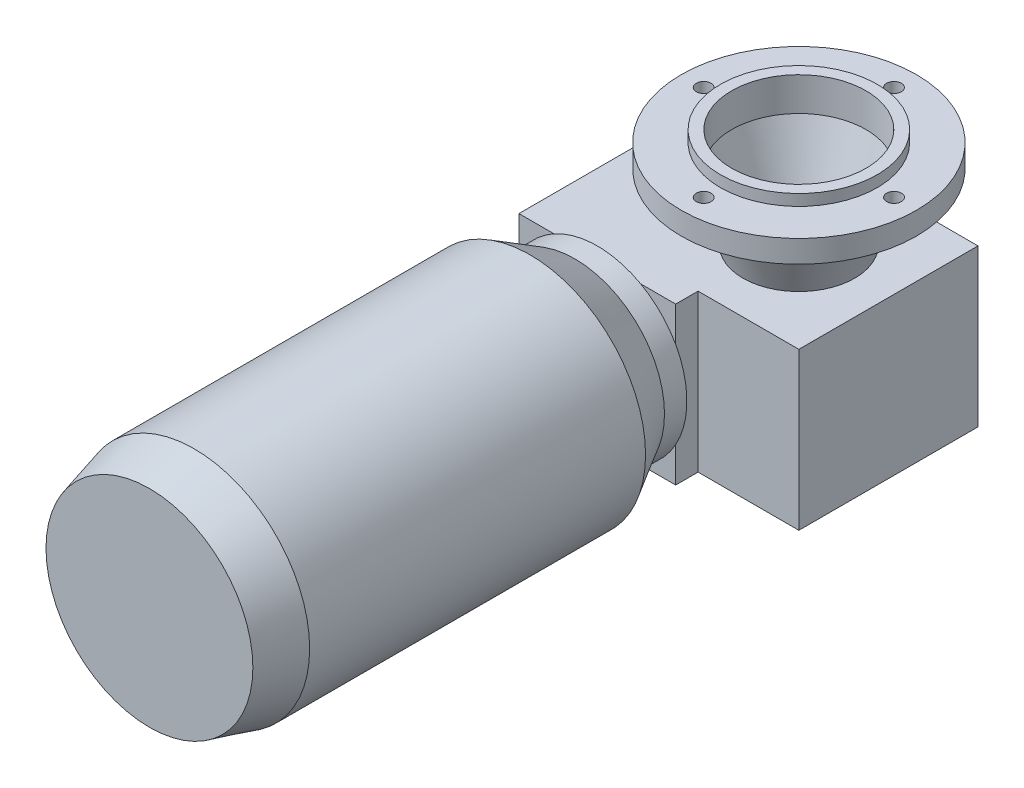
ISO-10303-21;
HEADER;
FILE_DESCRIPTION(('STEP AP214'),'2;1');
FILE_NAME('part.step','',(''),(''),'','','');
FILE_SCHEMA(('AUTOMOTIVE_DESIGN { 1 0 10303 214 1 1 1 1 }'));
ENDSEC;
DATA;
#1=APPLICATION_CONTEXT('core data for automotive mechanical design processes');
#2=APPLICATION_PROTOCOL_DEFINITION('international standard','automotive_design',2000,#1);
#3=PRODUCT_CONTEXT('',#1,'mechanical');
#4=PRODUCT('Part','Part','',(#3));
#5=PRODUCT_RELATED_PRODUCT_CATEGORY('part','',(#4));
#6=PRODUCT_DEFINITION_FORMATION('','',#4);
#7=PRODUCT_DEFINITION_CONTEXT('part definition',#1,'design');
#8=PRODUCT_DEFINITION('design','',#6,#7);
#9=PRODUCT_DEFINITION_SHAPE('','',#8);
#10=(LENGTH_UNIT() NAMED_UNIT(*) SI_UNIT(.MILLI.,.METRE.));
#11=(NAMED_UNIT(*) PLANE_ANGLE_UNIT() SI_UNIT($,.RADIAN.));
#12=(NAMED_UNIT(*) SI_UNIT($,.STERADIAN.) SOLID_ANGLE_UNIT());
#13=UNCERTAINTY_MEASURE_WITH_UNIT(LENGTH_MEASURE(1.E-05),#10,'distance_accuracy_value','');
#14=(GEOMETRIC_REPRESENTATION_CONTEXT(3) GLOBAL_UNCERTAINTY_ASSIGNED_CONTEXT((#13)) GLOBAL_UNIT_ASSIGNED_CONTEXT((#10,
#11,#12)) REPRESENTATION_CONTEXT('',''));
#15=CARTESIAN_POINT('',(0.,0.,0.));
#16=DIRECTION('',(0.,0.,1.));
#17=DIRECTION('',(1.,0.,0.));
#18=AXIS2_PLACEMENT_3D('',#15,#16,#17);
#19=CARTESIAN_POINT('',(-5.,-115.,-40.));
#20=DIRECTION('',(0.,1.,0.));
#21=DIRECTION('',(0.,0.,1.));
#22=AXIS2_PLACEMENT_3D('',#19,#20,#21);
#23=PLANE('',#22);
#24=DIRECTION('',(1.,0.,0.));
#25=VECTOR('',#24,1.);
#26=CARTESIAN_POINT('',(-5.,-115.,-40.));
#27=LINE('',#26,#25);
#28=CARTESIAN_POINT('',(-5.,-115.,-40.));
#29=VERTEX_POINT('',#28);
#30=CARTESIAN_POINT('',(40.,-115.,-40.));
#31=VERTEX_POINT('',#30);
#32=EDGE_CURVE('E198',#29,#31,#27,.T.);
#33=ORIENTED_EDGE('',*,*,#32,.T.);
#34=DIRECTION('',(0.,0.,1.));
#35=VECTOR('',#34,1.);
#36=CARTESIAN_POINT('',(40.,-115.,-40.));
#37=LINE('',#36,#35);
#38=CARTESIAN_POINT('',(40.,-115.,40.));
#39=VERTEX_POINT('',#38);
#40=EDGE_CURVE('E201',#31,#39,#37,.T.);
#41=ORIENTED_EDGE('',*,*,#40,.T.);
#42=DIRECTION('',(-1.,0.,0.));
#43=VECTOR('',#42,1.);
#44=CARTESIAN_POINT('',(40.,-115.,40.));
#45=LINE('',#44,#43);
#46=CARTESIAN_POINT('',(-5.,-115.,40.));
#47=VERTEX_POINT('',#46);
#48=EDGE_CURVE('E203',#39,#47,#45,.T.);
#49=ORIENTED_EDGE('',*,*,#48,.T.);
#50=DIRECTION('',(0.,0.,1.));
#51=VECTOR('',#50,1.);
#52=CARTESIAN_POINT('',(-5.,-115.,40.));
#53=LINE('',#52,#51);
#54=CARTESIAN_POINT('',(-5.,-115.,50.));
#55=VERTEX_POINT('',#54);
#56=EDGE_CURVE('E205',#47,#55,#53,.T.);
#57=ORIENTED_EDGE('',*,*,#56,.T.);
#58=DIRECTION('',(-1.,0.,0.));
#59=VECTOR('',#58,1.);
#60=CARTESIAN_POINT('',(-5.,-115.,50.));
#61=LINE('',#60,#59);
#62=CARTESIAN_POINT('',(-20.6350832689629,-115.,50.));
#63=VERTEX_POINT('',#62);
#64=EDGE_CURVE('E129',#55,#63,#61,.T.);
#65=ORIENTED_EDGE('',*,*,#64,.T.);
#66=CARTESIAN_POINT('',(-59.3649167310371,-115.,50.));
#67=VERTEX_POINT('',#66);
#68=EDGE_CURVE('E209',#63,#67,#61,.T.);
#69=ORIENTED_EDGE('',*,*,#68,.T.);
#70=CARTESIAN_POINT('',(-75.,-115.,50.));
#71=VERTEX_POINT('',#70);
#72=EDGE_CURVE('E56',#67,#71,#61,.T.);
#73=ORIENTED_EDGE('',*,*,#72,.T.);
#74=DIRECTION('',(0.,0.,-1.));
#75=VECTOR('',#74,1.);
#76=CARTESIAN_POINT('',(-75.,-115.,-60.));
#77=LINE('',#76,#75);
#78=CARTESIAN_POINT('',(-75.,-115.,-60.));
#79=VERTEX_POINT('',#78);
#80=EDGE_CURVE('E208',#71,#79,#77,.T.);
#81=ORIENTED_EDGE('',*,*,#80,.T.);
#82=DIRECTION('',(1.,0.,0.));
#83=VECTOR('',#82,1.);
#84=CARTESIAN_POINT('',(-4.99999999999999,-115.,-60.));
#85=LINE('',#84,#83);
#86=CARTESIAN_POINT('',(-4.99999999999999,-115.,-60.));
#87=VERTEX_POINT('',#86);
#88=EDGE_CURVE('E211',#79,#87,#85,.T.);
#89=ORIENTED_EDGE('',*,*,#88,.T.);
#90=DIRECTION('',(0.,0.,1.));
#91=VECTOR('',#90,1.);
#92=CARTESIAN_POINT('',(-5.,-115.,-40.));
#93=LINE('',#92,#91);
#94=EDGE_CURVE('E213',#87,#29,#93,.T.);
#95=ORIENTED_EDGE('',*,*,#94,.T.);
#96=EDGE_LOOP('',(#33,#41,#49,#57,#65,#69,#73,#81,#89,#95));
#97=FACE_BOUND('',#96,.T.);
#98=CARTESIAN_POINT('',(0.,-115.,0.));
#99=DIRECTION('',(0.,1.,0.));
#100=DIRECTION('',(0.,0.,1.));
#101=AXIS2_PLACEMENT_3D('',#98,#99,#100);
#102=CIRCLE('',#101,20.);
#103=CARTESIAN_POINT('',(0.,-115.,20.));
#104=VERTEX_POINT('',#103);
#105=EDGE_CURVE('E11',#104,#104,#102,.F.);
#106=ORIENTED_EDGE('',*,*,#105,.F.);
#107=EDGE_LOOP('',(#106));
#108=FACE_BOUND('',#107,.T.);
#109=ADVANCED_FACE('F33',(#97,#108),#23,.F.);
#110=CARTESIAN_POINT('',(-5.,-115.,50.));
#111=DIRECTION('',(0.,0.,-1.));
#112=DIRECTION('',(-1.,0.,0.));
#113=AXIS2_PLACEMENT_3D('',#110,#111,#112);
#114=PLANE('',#113);
#115=CARTESIAN_POINT('',(-40.,-80.,50.));
#116=DIRECTION('',(0.,0.,1.));
#117=DIRECTION('',(1.,0.,0.));
#118=AXIS2_PLACEMENT_3D('',#115,#116,#117);
#119=CIRCLE('',#118,40.);
#120=CARTESIAN_POINT('',(-5.,-60.6350832689629,50.));
#121=VERTEX_POINT('',#120);
#122=CARTESIAN_POINT('',(-20.6350832689629,-45.,50.));
#123=VERTEX_POINT('',#122);
#124=EDGE_CURVE('E48',#121,#123,#119,.T.);
#125=ORIENTED_EDGE('',*,*,#124,.F.);
#126=DIRECTION('',(0.,1.,0.));
#127=VECTOR('',#126,1.);
#128=CARTESIAN_POINT('',(-5.,-115.,50.));
#129=LINE('',#128,#127);
#130=CARTESIAN_POINT('',(-5.,-45.,50.));
#131=VERTEX_POINT('',#130);
#132=EDGE_CURVE('E135',#121,#131,#129,.T.);
#133=ORIENTED_EDGE('',*,*,#132,.T.);
#134=DIRECTION('',(-1.,0.,0.));
#135=VECTOR('',#134,1.);
#136=CARTESIAN_POINT('',(-5.,-45.,50.));
#137=LINE('',#136,#135);
#138=EDGE_CURVE('E187',#131,#123,#137,.T.);
#139=ORIENTED_EDGE('',*,*,#138,.T.);
#140=EDGE_LOOP('',(#125,#133,#139));
#141=FACE_BOUND('',#140,.T.);
#142=ADVANCED_FACE('F337',(#141),#114,.F.);
#143=CARTESIAN_POINT('',(-59.3649167310371,-45.,50.));
#144=VERTEX_POINT('',#143);
#145=CARTESIAN_POINT('',(-75.,-60.6350832689629,50.));
#146=VERTEX_POINT('',#145);
#147=EDGE_CURVE('E41',#144,#146,#119,.T.);
#148=ORIENTED_EDGE('',*,*,#147,.F.);
#149=CARTESIAN_POINT('',(-75.,-45.,50.));
#150=VERTEX_POINT('',#149);
#151=EDGE_CURVE('E172',#144,#150,#137,.T.);
#152=ORIENTED_EDGE('',*,*,#151,.T.);
#153=DIRECTION('',(0.,1.,0.));
#154=VECTOR('',#153,1.);
#155=CARTESIAN_POINT('',(-75.,-115.,50.));
#156=LINE('',#155,#154);
#157=EDGE_CURVE('E174',#146,#150,#156,.T.);
#158=ORIENTED_EDGE('',*,*,#157,.F.);
#159=EDGE_LOOP('',(#148,#152,#158));
#160=FACE_BOUND('',#159,.T.);
#161=ADVANCED_FACE('F171',(#160),#114,.F.);
#162=CARTESIAN_POINT('',(-75.,-99.3649167310371,50.));
#163=VERTEX_POINT('',#162);
#164=EDGE_CURVE('E152',#163,#67,#119,.T.);
#165=ORIENTED_EDGE('',*,*,#164,.F.);
#166=EDGE_CURVE('E224',#71,#163,#156,.T.);
#167=ORIENTED_EDGE('',*,*,#166,.F.);
#168=ORIENTED_EDGE('',*,*,#72,.F.);
#169=EDGE_LOOP('',(#165,#167,#168));
#170=FACE_BOUND('',#169,.T.);
#171=ADVANCED_FACE('F493',(#170),#114,.F.);
#172=CARTESIAN_POINT('',(-5.,-99.3649167310371,50.));
#173=VERTEX_POINT('',#172);
#174=EDGE_CURVE('E127',#63,#173,#119,.T.);
#175=ORIENTED_EDGE('',*,*,#174,.F.);
#176=ORIENTED_EDGE('',*,*,#64,.F.);
#177=EDGE_CURVE('E123',#55,#173,#129,.T.);
#178=ORIENTED_EDGE('',*,*,#177,.T.);
#179=EDGE_LOOP('',(#175,#176,#178));
#180=FACE_BOUND('',#179,.T.);
#181=ADVANCED_FACE('F125',(#180),#114,.F.);
#182=CARTESIAN_POINT('',(35.,-5.,0.));
#183=DIRECTION('',(0.,-1.,0.));
#184=DIRECTION('',(0.,0.,-1.));
#185=AXIS2_PLACEMENT_3D('',#182,#183,#184);
#186=PLANE('',#185);
#187=CARTESIAN_POINT('',(42.5,-5.,0.));
#188=DIRECTION('',(0.,1.,0.));
#189=DIRECTION('',(0.,0.,1.));
#190=AXIS2_PLACEMENT_3D('',#187,#188,#189);
#191=CIRCLE('',#190,3.29999999999999);
#192=CARTESIAN_POINT('',(42.5,-5.,3.29999999999999));
#193=VERTEX_POINT('',#192);
#194=EDGE_CURVE('E245',#193,#193,#191,.T.);
#195=ORIENTED_EDGE('',*,*,#194,.F.);
#196=EDGE_LOOP('',(#195));
#197=FACE_BOUND('',#196,.T.);
#198=CARTESIAN_POINT('',(0.,-5.,42.5));
#199=DIRECTION('',(0.,1.,0.));
#200=DIRECTION('',(0.,0.,1.));
#201=AXIS2_PLACEMENT_3D('',#198,#199,#200);
#202=CIRCLE('',#201,3.29999999999999);
#203=CARTESIAN_POINT('',(0.,-5.,45.8));
#204=VERTEX_POINT('',#203);
#205=EDGE_CURVE('E257',#204,#204,#202,.T.);
#206=ORIENTED_EDGE('',*,*,#205,.F.);
#207=EDGE_LOOP('',(#206));
#208=FACE_BOUND('',#207,.T.);
#209=CARTESIAN_POINT('',(0.,-5.,0.));
#210=DIRECTION('',(0.,1.,0.));
#211=DIRECTION('',(0.,0.,1.));
#212=AXIS2_PLACEMENT_3D('',#209,#210,#211);
#213=CIRCLE('',#212,35.);
#214=CARTESIAN_POINT('',(0.,-5.,35.));
#215=VERTEX_POINT('',#214);
#216=EDGE_CURVE('E269',#215,#215,#213,.T.);
#217=ORIENTED_EDGE('',*,*,#216,.F.);
#218=EDGE_LOOP('',(#217));
#219=FACE_BOUND('',#218,.T.);
#220=CARTESIAN_POINT('',(0.,-5.,0.));
#221=DIRECTION('',(0.,1.,0.));
#222=DIRECTION('',(0.,0.,1.));
#223=AXIS2_PLACEMENT_3D('',#220,#221,#222);
#224=CIRCLE('',#223,52.5);
#225=CARTESIAN_POINT('',(0.,-5.,52.5));
#226=VERTEX_POINT('',#225);
#227=EDGE_CURVE('E272',#226,#226,#224,.T.);
#228=ORIENTED_EDGE('',*,*,#227,.T.);
#229=EDGE_LOOP('',(#228));
#230=FACE_BOUND('',#229,.T.);
#231=CARTESIAN_POINT('',(0.,-5.,-42.5));
#232=DIRECTION('',(0.,1.,0.));
#233=DIRECTION('',(0.,0.,1.));
#234=AXIS2_PLACEMENT_3D('',#231,#232,#233);
#235=CIRCLE('',#234,3.29999999999999);
#236=CARTESIAN_POINT('',(0.,-5.,-39.2));
#237=VERTEX_POINT('',#236);
#238=EDGE_CURVE('E251',#237,#237,#235,.T.);
#239=ORIENTED_EDGE('',*,*,#238,.F.);
#240=EDGE_LOOP('',(#239));
#241=FACE_BOUND('',#240,.T.);
#242=CARTESIAN_POINT('',(-42.5,-5.,0.));
#243=DIRECTION('',(0.,1.,0.));
#244=DIRECTION('',(0.,0.,1.));
#245=AXIS2_PLACEMENT_3D('',#242,#243,#244);
#246=CIRCLE('',#245,3.29999999999999);
#247=CARTESIAN_POINT('',(-42.5,-5.,3.29999999999999));
#248=VERTEX_POINT('',#247);
#249=EDGE_CURVE('E239',#248,#248,#246,.T.);
#250=ORIENTED_EDGE('',*,*,#249,.F.);
#251=EDGE_LOOP('',(#250));
#252=FACE_BOUND('',#251,.T.);
#253=ADVANCED_FACE('F293',(#197,#208,#219,#230,#241,#252),#186,.F.);
#254=CARTESIAN_POINT('',(0.,32.3842170160296,0.));
#255=DIRECTION('',(0.,1.,0.));
#256=DIRECTION('',(0.,0.,1.));
#257=AXIS2_PLACEMENT_3D('',#254,#255,#256);
#258=CYLINDRICAL_SURFACE('',#257,30.);
#259=CARTESIAN_POINT('',(0.,-15.,0.));
#260=DIRECTION('',(0.,1.,0.));
#261=DIRECTION('',(0.,0.,1.));
#262=AXIS2_PLACEMENT_3D('',#259,#260,#261);
#263=CIRCLE('',#262,30.);
#264=CARTESIAN_POINT('',(0.,-15.,30.));
#265=VERTEX_POINT('',#264);
#266=EDGE_CURVE('E153',#265,#265,#263,.T.);
#267=ORIENTED_EDGE('',*,*,#266,.F.);
#268=EDGE_LOOP('',(#267));
#269=FACE_BOUND('',#268,.T.);
#270=CARTESIAN_POINT('',(0.,0.,0.));
#271=DIRECTION('',(0.,1.,0.));
#272=DIRECTION('',(0.,0.,1.));
#273=AXIS2_PLACEMENT_3D('',#270,#271,#272);
#274=CIRCLE('',#273,30.);
#275=CARTESIAN_POINT('',(0.,0.,30.));
#276=VERTEX_POINT('',#275);
#277=EDGE_CURVE('E263',#276,#276,#274,.T.);
#278=ORIENTED_EDGE('',*,*,#277,.T.);
#279=EDGE_LOOP('',(#278));
#280=FACE_BOUND('',#279,.T.);
#281=ADVANCED_FACE('F35',(#269,#280),#258,.F.);
#282=CARTESIAN_POINT('',(0.,-15.,0.));
#283=DIRECTION('',(0.,1.,0.));
#284=DIRECTION('',(0.,0.,1.));
#285=AXIS2_PLACEMENT_3D('',#282,#283,#284);
#286=CONICAL_SURFACE('',#285,30.,0.345555580581712);
#287=CARTESIAN_POINT('',(0.,-40.,0.));
#288=DIRECTION('',(0.,1.,0.));
#289=DIRECTION('',(0.,0.,1.));
#290=AXIS2_PLACEMENT_3D('',#287,#288,#289);
#291=CIRCLE('',#290,21.);
#292=CARTESIAN_POINT('',(0.,-40.,21.));
#293=VERTEX_POINT('',#292);
#294=EDGE_CURVE('E155',#293,#293,#291,.T.);
#295=ORIENTED_EDGE('',*,*,#294,.F.);
#296=EDGE_LOOP('',(#295));
#297=FACE_BOUND('',#296,.T.);
#298=ORIENTED_EDGE('',*,*,#266,.T.);
#299=EDGE_LOOP('',(#298));
#300=FACE_BOUND('',#299,.T.);
#301=ADVANCED_FACE('F286',(#297,#300),#286,.F.);
#302=CARTESIAN_POINT('',(0.,-40.,0.));
#303=DIRECTION('',(0.,-1.,0.));
#304=DIRECTION('',(0.,0.,-1.));
#305=AXIS2_PLACEMENT_3D('',#302,#303,#304);
#306=PLANE('',#305);
#307=ORIENTED_EDGE('',*,*,#294,.T.);
#308=EDGE_LOOP('',(#307));
#309=FACE_BOUND('',#308,.T.);
#310=ADVANCED_FACE('F284',(#309),#306,.F.);
#311=CARTESIAN_POINT('',(0.,-45.,0.));
#312=DIRECTION('',(0.,1.,0.));
#313=DIRECTION('',(0.,0.,1.));
#314=AXIS2_PLACEMENT_3D('',#311,#312,#313);
#315=CONICAL_SURFACE('',#314,25.,0.345555580581709);
#316=CARTESIAN_POINT('',(0.,-15.0000000000002,0.));
#317=DIRECTION('',(0.,1.,0.));
#318=DIRECTION('',(0.,0.,1.));
#319=AXIS2_PLACEMENT_3D('',#316,#317,#318);
#320=CIRCLE('',#319,35.7999999999998);
#321=CARTESIAN_POINT('',(0.,-15.0000000000002,35.7999999999998));
#322=VERTEX_POINT('',#321);
#323=EDGE_CURVE('E278',#322,#322,#320,.T.);
#324=ORIENTED_EDGE('',*,*,#323,.F.);
#325=EDGE_LOOP('',(#324));
#326=FACE_BOUND('',#325,.T.);
#327=CARTESIAN_POINT('',(0.,-45.,0.));
#328=DIRECTION('',(0.,1.,0.));
#329=DIRECTION('',(0.,0.,1.));
#330=AXIS2_PLACEMENT_3D('',#327,#328,#329);
#331=CIRCLE('',#330,25.);
#332=CARTESIAN_POINT('',(0.,-45.,25.));
#333=VERTEX_POINT('',#332);
#334=EDGE_CURVE('E236',#333,#333,#331,.T.);
#335=ORIENTED_EDGE('',*,*,#334,.T.);
#336=EDGE_LOOP('',(#335));
#337=FACE_BOUND('',#336,.T.);
#338=ADVANCED_FACE('F536',(#326,#337),#315,.T.);
#339=CARTESIAN_POINT('',(52.5,-15.,0.));
#340=DIRECTION('',(0.,1.,0.));
#341=DIRECTION('',(0.,0.,1.));
#342=AXIS2_PLACEMENT_3D('',#339,#340,#341);
#343=PLANE('',#342);
#344=CARTESIAN_POINT('',(-42.5,-15.,0.));
#345=DIRECTION('',(0.,1.,0.));
#346=DIRECTION('',(0.,0.,1.));
#347=AXIS2_PLACEMENT_3D('',#344,#345,#346);
#348=CIRCLE('',#347,3.29999999999999);
#349=CARTESIAN_POINT('',(-42.5,-15.,3.29999999999999));
#350=VERTEX_POINT('',#349);
#351=EDGE_CURVE('E242',#350,#350,#348,.T.);
#352=ORIENTED_EDGE('',*,*,#351,.T.);
#353=EDGE_LOOP('',(#352));
#354=FACE_BOUND('',#353,.T.);
#355=CARTESIAN_POINT('',(42.5,-15.,0.));
#356=DIRECTION('',(0.,1.,0.));
#357=DIRECTION('',(0.,0.,1.));
#358=AXIS2_PLACEMENT_3D('',#355,#356,#357);
#359=CIRCLE('',#358,3.29999999999999);
#360=CARTESIAN_POINT('',(42.5,-15.,3.29999999999999));
#361=VERTEX_POINT('',#360);
#362=EDGE_CURVE('E248',#361,#361,#359,.T.);
#363=ORIENTED_EDGE('',*,*,#362,.T.);
#364=EDGE_LOOP('',(#363));
#365=FACE_BOUND('',#364,.T.);
#366=CARTESIAN_POINT('',(0.,-15.,-42.5));
#367=DIRECTION('',(0.,1.,0.));
#368=DIRECTION('',(0.,0.,1.));
#369=AXIS2_PLACEMENT_3D('',#366,#367,#368);
#370=CIRCLE('',#369,3.29999999999999);
#371=CARTESIAN_POINT('',(0.,-15.,-39.2));
#372=VERTEX_POINT('',#371);
#373=EDGE_CURVE('E254',#372,#372,#370,.T.);
#374=ORIENTED_EDGE('',*,*,#373,.T.);
#375=EDGE_LOOP('',(#374));
#376=FACE_BOUND('',#375,.T.);
#377=CARTESIAN_POINT('',(0.,-15.,42.5));
#378=DIRECTION('',(0.,1.,0.));
#379=DIRECTION('',(0.,0.,1.));
#380=AXIS2_PLACEMENT_3D('',#377,#378,#379);
#381=CIRCLE('',#380,3.29999999999999);
#382=CARTESIAN_POINT('',(0.,-15.,45.8));
#383=VERTEX_POINT('',#382);
#384=EDGE_CURVE('E260',#383,#383,#381,.T.);
#385=ORIENTED_EDGE('',*,*,#384,.T.);
#386=EDGE_LOOP('',(#385));
#387=FACE_BOUND('',#386,.T.);
#388=CARTESIAN_POINT('',(0.,-15.,0.));
#389=DIRECTION('',(0.,1.,0.));
#390=DIRECTION('',(0.,0.,1.));
#391=AXIS2_PLACEMENT_3D('',#388,#389,#390);
#392=CIRCLE('',#391,52.5);
#393=CARTESIAN_POINT('',(0.,-15.,52.5));
#394=VERTEX_POINT('',#393);
#395=EDGE_CURVE('E275',#394,#394,#392,.T.);
#396=ORIENTED_EDGE('',*,*,#395,.F.);
#397=EDGE_LOOP('',(#396));
#398=FACE_BOUND('',#397,.T.);
#399=ORIENTED_EDGE('',*,*,#323,.T.);
#400=EDGE_LOOP('',(#399));
#401=FACE_BOUND('',#400,.T.);
#402=ADVANCED_FACE('F545',(#354,#365,#376,#387,#398,#401),#343,.F.);
#403=CARTESIAN_POINT('',(0.,32.3842170160296,0.));
#404=DIRECTION('',(0.,1.,0.));
#405=DIRECTION('',(0.,0.,1.));
#406=AXIS2_PLACEMENT_3D('',#403,#404,#405);
#407=CYLINDRICAL_SURFACE('',#406,52.5);
#408=ORIENTED_EDGE('',*,*,#227,.F.);
#409=EDGE_LOOP('',(#408));
#410=FACE_BOUND('',#409,.T.);
#411=ORIENTED_EDGE('',*,*,#395,.T.);
#412=EDGE_LOOP('',(#411));
#413=FACE_BOUND('',#412,.T.);
#414=ADVANCED_FACE('F306',(#410,#413),#407,.T.);
#415=CARTESIAN_POINT('',(0.,32.3842170160296,0.));
#416=DIRECTION('',(0.,1.,0.));
#417=DIRECTION('',(0.,0.,1.));
#418=AXIS2_PLACEMENT_3D('',#415,#416,#417);
#419=CYLINDRICAL_SURFACE('',#418,35.);
#420=CARTESIAN_POINT('',(0.,0.,0.));
#421=DIRECTION('',(0.,1.,0.));
#422=DIRECTION('',(0.,0.,1.));
#423=AXIS2_PLACEMENT_3D('',#420,#421,#422);
#424=CIRCLE('',#423,35.);
#425=CARTESIAN_POINT('',(0.,0.,35.));
#426=VERTEX_POINT('',#425);
#427=EDGE_CURVE('E266',#426,#426,#424,.T.);
#428=ORIENTED_EDGE('',*,*,#427,.F.);
#429=EDGE_LOOP('',(#428));
#430=FACE_BOUND('',#429,.T.);
#431=ORIENTED_EDGE('',*,*,#216,.T.);
#432=EDGE_LOOP('',(#431));
#433=FACE_BOUND('',#432,.T.);
#434=ADVANCED_FACE('F300',(#430,#433),#419,.T.);
#435=CARTESIAN_POINT('',(30.,0.,0.));
#436=DIRECTION('',(0.,-1.,0.));
#437=DIRECTION('',(0.,0.,-1.));
#438=AXIS2_PLACEMENT_3D('',#435,#436,#437);
#439=PLANE('',#438);
#440=ORIENTED_EDGE('',*,*,#277,.F.);
#441=EDGE_LOOP('',(#440));
#442=FACE_BOUND('',#441,.T.);
#443=ORIENTED_EDGE('',*,*,#427,.T.);
#444=EDGE_LOOP('',(#443));
#445=FACE_BOUND('',#444,.T.);
#446=ADVANCED_FACE('F296',(#442,#445),#439,.F.);
#447=CARTESIAN_POINT('',(0.,-5.,42.5));
#448=DIRECTION('',(0.,1.,0.));
#449=DIRECTION('',(0.,0.,1.));
#450=AXIS2_PLACEMENT_3D('',#447,#448,#449);
#451=CYLINDRICAL_SURFACE('',#450,3.29999999999999);
#452=ORIENTED_EDGE('',*,*,#384,.F.);
#453=EDGE_LOOP('',(#452));
#454=FACE_BOUND('',#453,.T.);
#455=ORIENTED_EDGE('',*,*,#205,.T.);
#456=EDGE_LOOP('',(#455));
#457=FACE_BOUND('',#456,.T.);
#458=ADVANCED_FACE('F299',(#454,#457),#451,.F.);
#459=CARTESIAN_POINT('',(0.,-5.,-42.5));
#460=DIRECTION('',(0.,1.,0.));
#461=DIRECTION('',(0.,0.,1.));
#462=AXIS2_PLACEMENT_3D('',#459,#460,#461);
#463=CYLINDRICAL_SURFACE('',#462,3.29999999999999);
#464=ORIENTED_EDGE('',*,*,#373,.F.);
#465=EDGE_LOOP('',(#464));
#466=FACE_BOUND('',#465,.T.);
#467=ORIENTED_EDGE('',*,*,#238,.T.);
#468=EDGE_LOOP('',(#467));
#469=FACE_BOUND('',#468,.T.);
#470=ADVANCED_FACE('F331',(#466,#469),#463,.F.);
#471=CARTESIAN_POINT('',(42.5,-5.,0.));
#472=DIRECTION('',(0.,1.,0.));
#473=DIRECTION('',(0.,0.,1.));
#474=AXIS2_PLACEMENT_3D('',#471,#472,#473);
#475=CYLINDRICAL_SURFACE('',#474,3.29999999999999);
#476=ORIENTED_EDGE('',*,*,#362,.F.);
#477=EDGE_LOOP('',(#476));
#478=FACE_BOUND('',#477,.T.);
#479=ORIENTED_EDGE('',*,*,#194,.T.);
#480=EDGE_LOOP('',(#479));
#481=FACE_BOUND('',#480,.T.);
#482=ADVANCED_FACE('F322',(#478,#481),#475,.F.);
#483=CARTESIAN_POINT('',(-42.5,-5.,0.));
#484=DIRECTION('',(0.,1.,0.));
#485=DIRECTION('',(0.,0.,1.));
#486=AXIS2_PLACEMENT_3D('',#483,#484,#485);
#487=CYLINDRICAL_SURFACE('',#486,3.29999999999999);
#488=ORIENTED_EDGE('',*,*,#351,.F.);
#489=EDGE_LOOP('',(#488));
#490=FACE_BOUND('',#489,.T.);
#491=ORIENTED_EDGE('',*,*,#249,.T.);
#492=EDGE_LOOP('',(#491));
#493=FACE_BOUND('',#492,.T.);
#494=ADVANCED_FACE('F320',(#490,#493),#487,.F.);
#495=CARTESIAN_POINT('',(-5.,-45.,-40.));
#496=DIRECTION('',(0.,1.,0.));
#497=DIRECTION('',(0.,0.,1.));
#498=AXIS2_PLACEMENT_3D('',#495,#496,#497);
#499=PLANE('',#498);
#500=DIRECTION('',(1.,0.,0.));
#501=VECTOR('',#500,1.);
#502=CARTESIAN_POINT('',(-5.,-45.,-40.));
#503=LINE('',#502,#501);
#504=CARTESIAN_POINT('',(-5.,-45.,-40.));
#505=VERTEX_POINT('',#504);
#506=CARTESIAN_POINT('',(40.,-45.,-40.));
#507=VERTEX_POINT('',#506);
#508=EDGE_CURVE('E162',#505,#507,#503,.T.);
#509=ORIENTED_EDGE('',*,*,#508,.F.);
#510=DIRECTION('',(0.,0.,1.));
#511=VECTOR('',#510,1.);
#512=CARTESIAN_POINT('',(-5.,-45.,-40.));
#513=LINE('',#512,#511);
#514=CARTESIAN_POINT('',(-4.99999999999999,-45.,-60.));
#515=VERTEX_POINT('',#514);
#516=EDGE_CURVE('E196',#515,#505,#513,.T.);
#517=ORIENTED_EDGE('',*,*,#516,.F.);
#518=DIRECTION('',(1.,0.,0.));
#519=VECTOR('',#518,1.);
#520=CARTESIAN_POINT('',(-4.99999999999999,-45.,-60.));
#521=LINE('',#520,#519);
#522=CARTESIAN_POINT('',(-75.,-45.,-60.));
#523=VERTEX_POINT('',#522);
#524=EDGE_CURVE('E194',#523,#515,#521,.T.);
#525=ORIENTED_EDGE('',*,*,#524,.F.);
#526=DIRECTION('',(0.,0.,-1.));
#527=VECTOR('',#526,1.);
#528=CARTESIAN_POINT('',(-75.,-45.,-60.));
#529=LINE('',#528,#527);
#530=EDGE_CURVE('E184',#150,#523,#529,.T.);
#531=ORIENTED_EDGE('',*,*,#530,.F.);
#532=ORIENTED_EDGE('',*,*,#151,.F.);
#533=EDGE_CURVE('E182',#123,#144,#137,.T.);
#534=ORIENTED_EDGE('',*,*,#533,.F.);
#535=ORIENTED_EDGE('',*,*,#138,.F.);
#536=DIRECTION('',(0.,0.,1.));
#537=VECTOR('',#536,1.);
#538=CARTESIAN_POINT('',(-5.,-45.,40.));
#539=LINE('',#538,#537);
#540=CARTESIAN_POINT('',(-5.,-45.,40.));
#541=VERTEX_POINT('',#540);
#542=EDGE_CURVE('E185',#541,#131,#539,.T.);
#543=ORIENTED_EDGE('',*,*,#542,.F.);
#544=DIRECTION('',(-1.,0.,0.));
#545=VECTOR('',#544,1.);
#546=CARTESIAN_POINT('',(40.,-45.,40.));
#547=LINE('',#546,#545);
#548=CARTESIAN_POINT('',(40.,-45.,40.));
#549=VERTEX_POINT('',#548);
#550=EDGE_CURVE('E379',#549,#541,#547,.T.);
#551=ORIENTED_EDGE('',*,*,#550,.F.);
#552=DIRECTION('',(0.,0.,1.));
#553=VECTOR('',#552,1.);
#554=CARTESIAN_POINT('',(40.,-45.,-40.));
#555=LINE('',#554,#553);
#556=EDGE_CURVE('E377',#507,#549,#555,.T.);
#557=ORIENTED_EDGE('',*,*,#556,.F.);
#558=EDGE_LOOP('',(#509,#517,#525,#531,#532,#534,#535,#543,#551,#557));
#559=FACE_BOUND('',#558,.T.);
#560=ORIENTED_EDGE('',*,*,#334,.F.);
#561=EDGE_LOOP('',(#560));
#562=FACE_BOUND('',#561,.T.);
#563=ADVANCED_FACE('F179',(#559,#562),#499,.T.);
#564=CARTESIAN_POINT('',(-5.,-115.,-40.));
#565=DIRECTION('',(0.,0.,1.));
#566=DIRECTION('',(1.,0.,0.));
#567=AXIS2_PLACEMENT_3D('',#564,#565,#566);
#568=PLANE('',#567);
#569=ORIENTED_EDGE('',*,*,#508,.T.);
#570=DIRECTION('',(0.,1.,0.));
#571=VECTOR('',#570,1.);
#572=CARTESIAN_POINT('',(40.,-115.,-40.));
#573=LINE('',#572,#571);
#574=EDGE_CURVE('E233',#31,#507,#573,.T.);
#575=ORIENTED_EDGE('',*,*,#574,.F.);
#576=ORIENTED_EDGE('',*,*,#32,.F.);
#577=DIRECTION('',(0.,1.,0.));
#578=VECTOR('',#577,1.);
#579=CARTESIAN_POINT('',(-5.,-115.,-40.));
#580=LINE('',#579,#578);
#581=EDGE_CURVE('E215',#29,#505,#580,.T.);
#582=ORIENTED_EDGE('',*,*,#581,.T.);
#583=EDGE_LOOP('',(#569,#575,#576,#582));
#584=FACE_BOUND('',#583,.T.);
#585=ADVANCED_FACE('F329',(#584),#568,.F.);
#586=CARTESIAN_POINT('',(40.,-115.,-40.));
#587=DIRECTION('',(-1.,0.,0.));
#588=DIRECTION('',(0.,0.,1.));
#589=AXIS2_PLACEMENT_3D('',#586,#587,#588);
#590=PLANE('',#589);
#591=ORIENTED_EDGE('',*,*,#556,.T.);
#592=DIRECTION('',(0.,1.,0.));
#593=VECTOR('',#592,1.);
#594=CARTESIAN_POINT('',(40.,-115.,40.));
#595=LINE('',#594,#593);
#596=EDGE_CURVE('E230',#39,#549,#595,.T.);
#597=ORIENTED_EDGE('',*,*,#596,.F.);
#598=ORIENTED_EDGE('',*,*,#40,.F.);
#599=ORIENTED_EDGE('',*,*,#574,.T.);
#600=EDGE_LOOP('',(#591,#597,#598,#599));
#601=FACE_BOUND('',#600,.T.);
#602=ADVANCED_FACE('F364',(#601),#590,.F.);
#603=CARTESIAN_POINT('',(40.,-115.,40.));
#604=DIRECTION('',(0.,0.,-1.));
#605=DIRECTION('',(-1.,0.,0.));
#606=AXIS2_PLACEMENT_3D('',#603,#604,#605);
#607=PLANE('',#606);
#608=ORIENTED_EDGE('',*,*,#550,.T.);
#609=DIRECTION('',(0.,1.,0.));
#610=VECTOR('',#609,1.);
#611=CARTESIAN_POINT('',(-5.,-115.,40.));
#612=LINE('',#611,#610);
#613=EDGE_CURVE('E132',#47,#541,#612,.T.);
#614=ORIENTED_EDGE('',*,*,#613,.F.);
#615=ORIENTED_EDGE('',*,*,#48,.F.);
#616=ORIENTED_EDGE('',*,*,#596,.T.);
#617=EDGE_LOOP('',(#608,#614,#615,#616));
#618=FACE_BOUND('',#617,.T.);
#619=ADVANCED_FACE('F361',(#618),#607,.F.);
#620=CARTESIAN_POINT('',(-5.,-115.,40.));
#621=DIRECTION('',(-1.,0.,0.));
#622=DIRECTION('',(0.,0.,1.));
#623=AXIS2_PLACEMENT_3D('',#620,#621,#622);
#624=PLANE('',#623);
#625=ORIENTED_EDGE('',*,*,#542,.T.);
#626=ORIENTED_EDGE('',*,*,#132,.F.);
#627=EDGE_CURVE('E133',#173,#121,#129,.T.);
#628=ORIENTED_EDGE('',*,*,#627,.F.);
#629=ORIENTED_EDGE('',*,*,#177,.F.);
#630=ORIENTED_EDGE('',*,*,#56,.F.);
#631=ORIENTED_EDGE('',*,*,#613,.T.);
#632=EDGE_LOOP('',(#625,#626,#628,#629,#630,#631));
#633=FACE_BOUND('',#632,.T.);
#634=ADVANCED_FACE('F139',(#633),#624,.F.);
#635=CARTESIAN_POINT('',(-75.,-115.,-60.));
#636=DIRECTION('',(1.,0.,0.));
#637=DIRECTION('',(0.,0.,-1.));
#638=AXIS2_PLACEMENT_3D('',#635,#636,#637);
#639=PLANE('',#638);
#640=ORIENTED_EDGE('',*,*,#530,.T.);
#641=DIRECTION('',(0.,1.,0.));
#642=VECTOR('',#641,1.);
#643=CARTESIAN_POINT('',(-75.,-115.,-60.));
#644=LINE('',#643,#642);
#645=EDGE_CURVE('E221',#79,#523,#644,.T.);
#646=ORIENTED_EDGE('',*,*,#645,.F.);
#647=ORIENTED_EDGE('',*,*,#80,.F.);
#648=ORIENTED_EDGE('',*,*,#166,.T.);
#649=EDGE_CURVE('E226',#163,#146,#156,.T.);
#650=ORIENTED_EDGE('',*,*,#649,.T.);
#651=ORIENTED_EDGE('',*,*,#157,.T.);
#652=EDGE_LOOP('',(#640,#646,#647,#648,#650,#651));
#653=FACE_BOUND('',#652,.T.);
#654=ADVANCED_FACE('F354',(#653),#639,.F.);
#655=CARTESIAN_POINT('',(-4.99999999999999,-115.,-60.));
#656=DIRECTION('',(0.,0.,1.));
#657=DIRECTION('',(1.,0.,0.));
#658=AXIS2_PLACEMENT_3D('',#655,#656,#657);
#659=PLANE('',#658);
#660=ORIENTED_EDGE('',*,*,#524,.T.);
#661=DIRECTION('',(0.,1.,0.));
#662=VECTOR('',#661,1.);
#663=CARTESIAN_POINT('',(-4.99999999999999,-115.,-60.));
#664=LINE('',#663,#662);
#665=EDGE_CURVE('E218',#87,#515,#664,.T.);
#666=ORIENTED_EDGE('',*,*,#665,.F.);
#667=ORIENTED_EDGE('',*,*,#88,.F.);
#668=ORIENTED_EDGE('',*,*,#645,.T.);
#669=EDGE_LOOP('',(#660,#666,#667,#668));
#670=FACE_BOUND('',#669,.T.);
#671=ADVANCED_FACE('F350',(#670),#659,.F.);
#672=CARTESIAN_POINT('',(-5.,-115.,-40.));
#673=DIRECTION('',(-1.,0.,0.));
#674=DIRECTION('',(0.,0.,1.));
#675=AXIS2_PLACEMENT_3D('',#672,#673,#674);
#676=PLANE('',#675);
#677=ORIENTED_EDGE('',*,*,#516,.T.);
#678=ORIENTED_EDGE('',*,*,#581,.F.);
#679=ORIENTED_EDGE('',*,*,#94,.F.);
#680=ORIENTED_EDGE('',*,*,#665,.T.);
#681=EDGE_LOOP('',(#677,#678,#679,#680));
#682=FACE_BOUND('',#681,.T.);
#683=ADVANCED_FACE('F347',(#682),#676,.F.);
#684=CARTESIAN_POINT('',(-40.,-80.,50.));
#685=DIRECTION('',(0.,0.,1.));
#686=DIRECTION('',(1.,0.,0.));
#687=AXIS2_PLACEMENT_3D('',#684,#685,#686);
#688=PLANE('',#687);
#689=EDGE_CURVE('E159',#123,#144,#119,.T.);
#690=ORIENTED_EDGE('',*,*,#689,.F.);
#691=ORIENTED_EDGE('',*,*,#533,.T.);
#692=EDGE_LOOP('',(#690,#691));
#693=FACE_BOUND('',#692,.T.);
#694=ADVANCED_FACE('F189',(#693),#688,.F.);
#695=ORIENTED_EDGE('',*,*,#649,.F.);
#696=EDGE_CURVE('E163',#146,#163,#119,.T.);
#697=ORIENTED_EDGE('',*,*,#696,.F.);
#698=EDGE_LOOP('',(#695,#697));
#699=FACE_BOUND('',#698,.T.);
#700=ADVANCED_FACE('F393',(#699),#688,.F.);
#701=EDGE_CURVE('E142',#173,#121,#119,.T.);
#702=ORIENTED_EDGE('',*,*,#701,.F.);
#703=ORIENTED_EDGE('',*,*,#627,.T.);
#704=EDGE_LOOP('',(#702,#703));
#705=FACE_BOUND('',#704,.T.);
#706=ADVANCED_FACE('F143',(#705),#688,.F.);
#707=CARTESIAN_POINT('',(-40.,-80.,60.));
#708=DIRECTION('',(0.,0.,-1.));
#709=DIRECTION('',(-1.,0.,0.));
#710=AXIS2_PLACEMENT_3D('',#707,#708,#709);
#711=CYLINDRICAL_SURFACE('',#710,40.);
#712=CARTESIAN_POINT('',(-40.,-80.,60.));
#713=DIRECTION('',(0.,0.,1.));
#714=DIRECTION('',(1.,0.,0.));
#715=AXIS2_PLACEMENT_3D('',#712,#713,#714);
#716=CIRCLE('',#715,40.);
#717=CARTESIAN_POINT('',(0.,-80.,60.));
#718=VERTEX_POINT('',#717);
#719=EDGE_CURVE('E158',#718,#718,#716,.T.);
#720=ORIENTED_EDGE('',*,*,#719,.F.);
#721=EDGE_LOOP('',(#720));
#722=FACE_BOUND('',#721,.T.);
#723=ORIENTED_EDGE('',*,*,#124,.T.);
#724=ORIENTED_EDGE('',*,*,#689,.T.);
#725=ORIENTED_EDGE('',*,*,#147,.T.);
#726=ORIENTED_EDGE('',*,*,#696,.T.);
#727=ORIENTED_EDGE('',*,*,#164,.T.);
#728=EDGE_CURVE('E145',#67,#63,#119,.T.);
#729=ORIENTED_EDGE('',*,*,#728,.T.);
#730=ORIENTED_EDGE('',*,*,#174,.T.);
#731=ORIENTED_EDGE('',*,*,#701,.T.);
#732=EDGE_LOOP('',(#723,#724,#725,#726,#727,#729,#730,#731));
#733=FACE_BOUND('',#732,.T.);
#734=ADVANCED_FACE('F149',(#722,#733),#711,.T.);
#735=ORIENTED_EDGE('',*,*,#68,.F.);
#736=ORIENTED_EDGE('',*,*,#728,.F.);
#737=EDGE_LOOP('',(#735,#736));
#738=FACE_BOUND('',#737,.T.);
#739=ADVANCED_FACE('F400',(#738),#688,.F.);
#740=CARTESIAN_POINT('',(-40.,-80.,60.));
#741=DIRECTION('',(0.,0.,1.));
#742=DIRECTION('',(1.,0.,0.));
#743=AXIS2_PLACEMENT_3D('',#740,#741,#742);
#744=CONICAL_SURFACE('',#743,40.,0.5235987755983);
#745=CARTESIAN_POINT('',(-40.,-80.,80.));
#746=DIRECTION('',(0.,0.,1.));
#747=DIRECTION('',(1.,0.,0.));
#748=AXIS2_PLACEMENT_3D('',#745,#746,#747);
#749=CIRCLE('',#748,51.5470053837926);
#750=CARTESIAN_POINT('',(11.5470053837926,-80.,80.));
#751=VERTEX_POINT('',#750);
#752=EDGE_CURVE('E146',#751,#751,#749,.T.);
#753=ORIENTED_EDGE('',*,*,#752,.F.);
#754=EDGE_LOOP('',(#753));
#755=FACE_BOUND('',#754,.T.);
#756=ORIENTED_EDGE('',*,*,#719,.T.);
#757=EDGE_LOOP('',(#756));
#758=FACE_BOUND('',#757,.T.);
#759=ADVANCED_FACE('F403',(#755,#758),#744,.T.);
#760=CARTESIAN_POINT('',(-40.,-80.,230.));
#761=DIRECTION('',(0.,0.,-1.));
#762=DIRECTION('',(-1.,0.,0.));
#763=AXIS2_PLACEMENT_3D('',#760,#761,#762);
#764=CYLINDRICAL_SURFACE('',#763,51.5470053837926);
#765=CARTESIAN_POINT('',(-40.,-80.,230.));
#766=DIRECTION('',(0.,0.,1.));
#767=DIRECTION('',(1.,0.,0.));
#768=AXIS2_PLACEMENT_3D('',#765,#766,#767);
#769=CIRCLE('',#768,51.5470053837926);
#770=CARTESIAN_POINT('',(11.5470053837926,-80.,230.));
#771=VERTEX_POINT('',#770);
#772=EDGE_CURVE('E423',#771,#771,#769,.T.);
#773=ORIENTED_EDGE('',*,*,#772,.F.);
#774=EDGE_LOOP('',(#773));
#775=FACE_BOUND('',#774,.T.);
#776=ORIENTED_EDGE('',*,*,#752,.T.);
#777=EDGE_LOOP('',(#776));
#778=FACE_BOUND('',#777,.T.);
#779=ADVANCED_FACE('F413',(#775,#778),#764,.T.);
#780=CARTESIAN_POINT('',(-40.,-80.,230.));
#781=DIRECTION('',(0.,0.,-1.));
#782=DIRECTION('',(1.,0.,0.));
#783=AXIS2_PLACEMENT_3D('',#780,#781,#782);
#784=CONICAL_SURFACE('',#783,51.5470053837926,0.26179938779915);
#785=CARTESIAN_POINT('',(-40.,-80.,250.));
#786=DIRECTION('',(0.,0.,1.));
#787=DIRECTION('',(1.,0.,0.));
#788=AXIS2_PLACEMENT_3D('',#785,#786,#787);
#789=CIRCLE('',#788,46.1880215351701);
#790=CARTESIAN_POINT('',(6.1880215351701,-80.,250.));
#791=VERTEX_POINT('',#790);
#792=EDGE_CURVE('E425',#791,#791,#789,.T.);
#793=ORIENTED_EDGE('',*,*,#792,.F.);
#794=EDGE_LOOP('',(#793));
#795=FACE_BOUND('',#794,.T.);
#796=ORIENTED_EDGE('',*,*,#772,.T.);
#797=EDGE_LOOP('',(#796));
#798=FACE_BOUND('',#797,.T.);
#799=ADVANCED_FACE('F418',(#795,#798),#784,.T.);
#800=CARTESIAN_POINT('',(-40.,-80.,250.));
#801=DIRECTION('',(0.,0.,1.));
#802=DIRECTION('',(1.,0.,0.));
#803=AXIS2_PLACEMENT_3D('',#800,#801,#802);
#804=PLANE('',#803);
#805=ORIENTED_EDGE('',*,*,#792,.T.);
#806=EDGE_LOOP('',(#805));
#807=FACE_BOUND('',#806,.T.);
#808=ADVANCED_FACE('F439',(#807),#804,.T.);
#809=CARTESIAN_POINT('',(0.,-120.,0.));
#810=DIRECTION('',(0.,1.,0.));
#811=DIRECTION('',(0.,0.,1.));
#812=AXIS2_PLACEMENT_3D('',#809,#810,#811);
#813=CYLINDRICAL_SURFACE('',#812,20.);
#814=CARTESIAN_POINT('',(0.,-120.,0.));
#815=DIRECTION('',(0.,-1.,0.));
#816=DIRECTION('',(0.,0.,-1.));
#817=AXIS2_PLACEMENT_3D('',#814,#815,#816);
#818=CIRCLE('',#817,20.);
#819=CARTESIAN_POINT('',(0.,-120.,-20.));
#820=VERTEX_POINT('',#819);
#821=EDGE_CURVE('E430',#820,#820,#818,.T.);
#822=ORIENTED_EDGE('',*,*,#821,.F.);
#823=EDGE_LOOP('',(#822));
#824=FACE_BOUND('',#823,.T.);
#825=ORIENTED_EDGE('',*,*,#105,.T.);
#826=EDGE_LOOP('',(#825));
#827=FACE_BOUND('',#826,.T.);
#828=ADVANCED_FACE('F436',(#824,#827),#813,.T.);
#829=CARTESIAN_POINT('',(0.,-120.,0.));
#830=DIRECTION('',(0.,-1.,0.));
#831=DIRECTION('',(0.,0.,-1.));
#832=AXIS2_PLACEMENT_3D('',#829,#830,#831);
#833=PLANE('',#832);
#834=ORIENTED_EDGE('',*,*,#821,.T.);
#835=EDGE_LOOP('',(#834));
#836=FACE_BOUND('',#835,.T.);
#837=ADVANCED_FACE('F434',(#836),#833,.T.);
#838=CLOSED_SHELL('',(#109,#142,#161,#171,#181,#253,#281,#301,#310,#338,#402,#414,#434,#446,
#458,#470,#482,#494,#563,#585,#602,#619,#634,#654,#671,#683,#694,#700,#706,#734,#739,#759,#779,
#799,#808,#828,#837));
#839=MANIFOLD_SOLID_BREP('B2',#838);
#840=ADVANCED_BREP_SHAPE_REPRESENTATION('',(#18,#839),#14);
#841=SHAPE_DEFINITION_REPRESENTATION(#9,#840);
ENDSEC;
END-ISO-10303-21;
